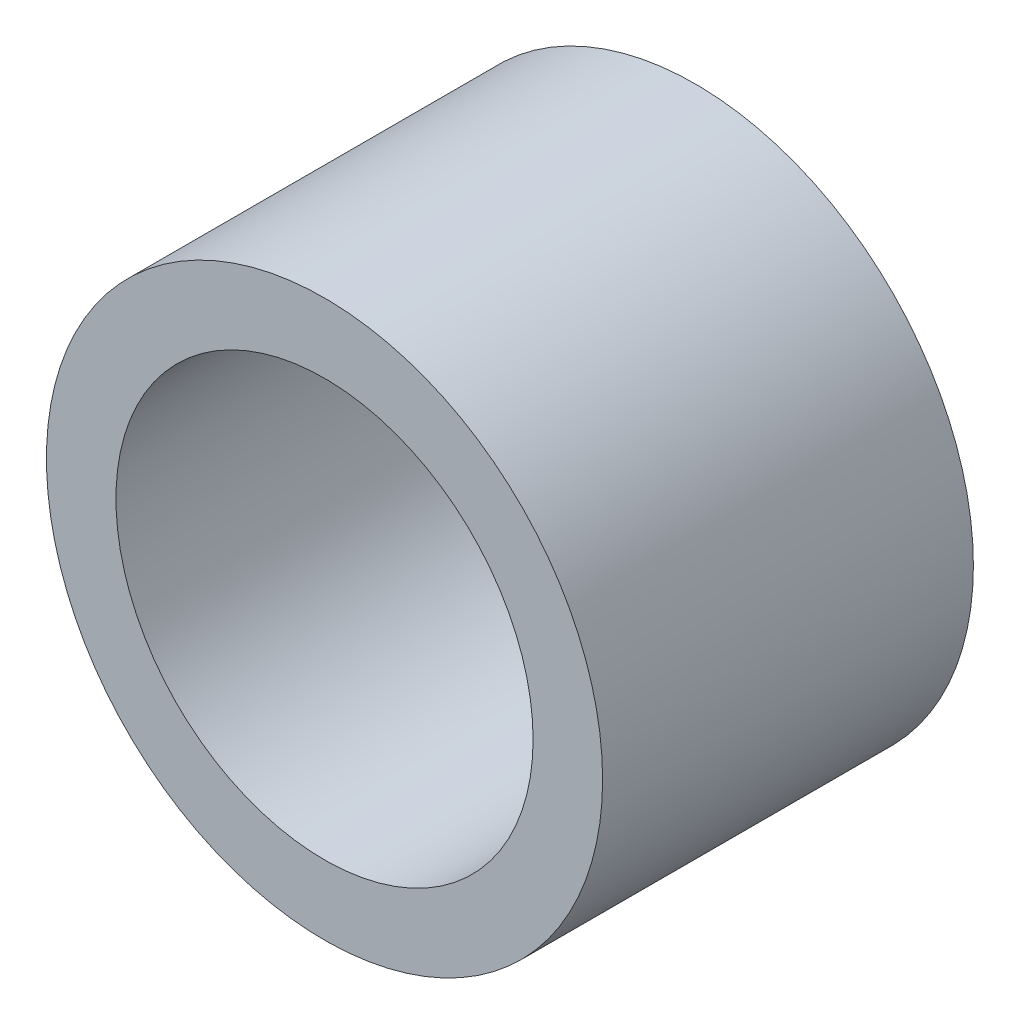
ISO-10303-21;
HEADER;
FILE_DESCRIPTION(('STEP AP214'),'2;1');
FILE_NAME('part.step','',(''),(''),'','','');
FILE_SCHEMA(('AUTOMOTIVE_DESIGN { 1 0 10303 214 1 1 1 1 }'));
ENDSEC;
DATA;
#1=APPLICATION_CONTEXT('core data for automotive mechanical design processes');
#2=APPLICATION_PROTOCOL_DEFINITION('international standard','automotive_design',2000,#1);
#3=PRODUCT_CONTEXT('',#1,'mechanical');
#4=PRODUCT('Part','Part','',(#3));
#5=PRODUCT_RELATED_PRODUCT_CATEGORY('part','',(#4));
#6=PRODUCT_DEFINITION_FORMATION('','',#4);
#7=PRODUCT_DEFINITION_CONTEXT('part definition',#1,'design');
#8=PRODUCT_DEFINITION('design','',#6,#7);
#9=PRODUCT_DEFINITION_SHAPE('','',#8);
#10=(LENGTH_UNIT() NAMED_UNIT(*) SI_UNIT(.MILLI.,.METRE.));
#11=(NAMED_UNIT(*) PLANE_ANGLE_UNIT() SI_UNIT($,.RADIAN.));
#12=(NAMED_UNIT(*) SI_UNIT($,.STERADIAN.) SOLID_ANGLE_UNIT());
#13=UNCERTAINTY_MEASURE_WITH_UNIT(LENGTH_MEASURE(1.E-05),#10,'distance_accuracy_value','');
#14=(GEOMETRIC_REPRESENTATION_CONTEXT(3) GLOBAL_UNCERTAINTY_ASSIGNED_CONTEXT((#13)) GLOBAL_UNIT_ASSIGNED_CONTEXT((#10,
#11,#12)) REPRESENTATION_CONTEXT('',''));
#15=CARTESIAN_POINT('',(0.,0.,0.));
#16=DIRECTION('',(0.,0.,1.));
#17=DIRECTION('',(1.,0.,0.));
#18=AXIS2_PLACEMENT_3D('',#15,#16,#17);
#19=CARTESIAN_POINT('',(0.,0.,80.));
#20=DIRECTION('',(0.,0.,1.));
#21=DIRECTION('',(1.,0.,0.));
#22=AXIS2_PLACEMENT_3D('',#19,#20,#21);
#23=PLANE('',#22);
#24=CARTESIAN_POINT('',(0.,0.,80.));
#25=DIRECTION('',(0.,0.,1.));
#26=DIRECTION('',(1.,0.,0.));
#27=AXIS2_PLACEMENT_3D('',#24,#25,#26);
#28=CIRCLE('',#27,60.);
#29=CARTESIAN_POINT('',(60.,0.,80.));
#30=VERTEX_POINT('',#29);
#31=EDGE_CURVE('E10',#30,#30,#28,.T.);
#32=ORIENTED_EDGE('',*,*,#31,.T.);
#33=EDGE_LOOP('',(#32));
#34=FACE_BOUND('',#33,.T.);
#35=CARTESIAN_POINT('',(0.,0.,80.));
#36=DIRECTION('',(0.,0.,1.));
#37=DIRECTION('',(1.,0.,0.));
#38=AXIS2_PLACEMENT_3D('',#35,#36,#37);
#39=CIRCLE('',#38,45.);
#40=CARTESIAN_POINT('',(45.,0.,80.));
#41=VERTEX_POINT('',#40);
#42=EDGE_CURVE('E50',#41,#41,#39,.T.);
#43=ORIENTED_EDGE('',*,*,#42,.F.);
#44=EDGE_LOOP('',(#43));
#45=FACE_BOUND('',#44,.T.);
#46=ADVANCED_FACE('F37',(#34,#45),#23,.T.);
#47=CARTESIAN_POINT('',(0.,0.,0.));
#48=DIRECTION('',(0.,0.,1.));
#49=DIRECTION('',(1.,0.,0.));
#50=AXIS2_PLACEMENT_3D('',#47,#48,#49);
#51=PLANE('',#50);
#52=CARTESIAN_POINT('',(0.,0.,0.));
#53=DIRECTION('',(0.,0.,1.));
#54=DIRECTION('',(1.,0.,0.));
#55=AXIS2_PLACEMENT_3D('',#52,#53,#54);
#56=CIRCLE('',#55,60.);
#57=CARTESIAN_POINT('',(60.,0.,0.));
#58=VERTEX_POINT('',#57);
#59=EDGE_CURVE('E41',#58,#58,#56,.T.);
#60=ORIENTED_EDGE('',*,*,#59,.F.);
#61=EDGE_LOOP('',(#60));
#62=FACE_BOUND('',#61,.T.);
#63=CARTESIAN_POINT('',(0.,0.,0.));
#64=DIRECTION('',(0.,0.,1.));
#65=DIRECTION('',(1.,0.,0.));
#66=AXIS2_PLACEMENT_3D('',#63,#64,#65);
#67=CIRCLE('',#66,45.);
#68=CARTESIAN_POINT('',(45.,0.,0.));
#69=VERTEX_POINT('',#68);
#70=EDGE_CURVE('E52',#69,#69,#67,.T.);
#71=ORIENTED_EDGE('',*,*,#70,.T.);
#72=EDGE_LOOP('',(#71));
#73=FACE_BOUND('',#72,.T.);
#74=ADVANCED_FACE('F64',(#62,#73),#51,.F.);
#75=CARTESIAN_POINT('',(0.,0.,80.));
#76=DIRECTION('',(0.,0.,-1.));
#77=DIRECTION('',(-1.,0.,0.));
#78=AXIS2_PLACEMENT_3D('',#75,#76,#77);
#79=CYLINDRICAL_SURFACE('',#78,60.);
#80=ORIENTED_EDGE('',*,*,#31,.F.);
#81=EDGE_LOOP('',(#80));
#82=FACE_BOUND('',#81,.T.);
#83=ORIENTED_EDGE('',*,*,#59,.T.);
#84=EDGE_LOOP('',(#83));
#85=FACE_BOUND('',#84,.T.);
#86=ADVANCED_FACE('F39',(#82,#85),#79,.T.);
#87=CARTESIAN_POINT('',(0.,0.,80.));
#88=DIRECTION('',(0.,0.,-1.));
#89=DIRECTION('',(-1.,0.,0.));
#90=AXIS2_PLACEMENT_3D('',#87,#88,#89);
#91=CYLINDRICAL_SURFACE('',#90,45.);
#92=ORIENTED_EDGE('',*,*,#42,.T.);
#93=EDGE_LOOP('',(#92));
#94=FACE_BOUND('',#93,.T.);
#95=ORIENTED_EDGE('',*,*,#70,.F.);
#96=EDGE_LOOP('',(#95));
#97=FACE_BOUND('',#96,.T.);
#98=ADVANCED_FACE('F60',(#94,#97),#91,.F.);
#99=CLOSED_SHELL('',(#46,#74,#86,#98));
#100=MANIFOLD_SOLID_BREP('B2',#99);
#101=ADVANCED_BREP_SHAPE_REPRESENTATION('',(#18,#100),#14);
#102=SHAPE_DEFINITION_REPRESENTATION(#9,#101);
ENDSEC;
END-ISO-10303-21;
